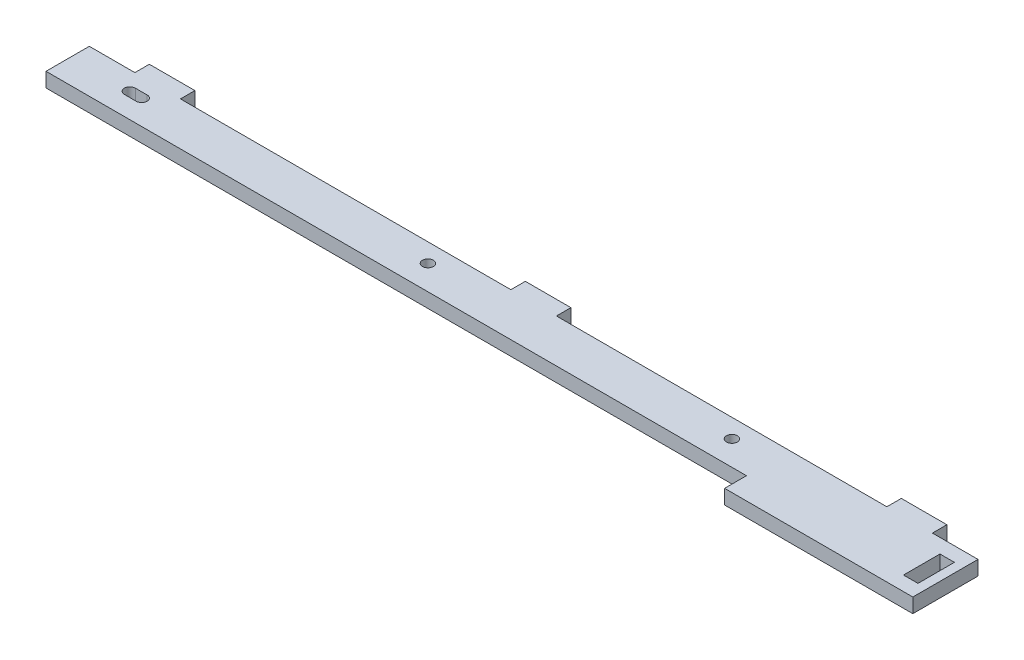
ISO-10303-21;
HEADER;
FILE_DESCRIPTION(('STEP AP214'),'2;1');
FILE_NAME('part.step','',(''),(''),'','','');
FILE_SCHEMA(('AUTOMOTIVE_DESIGN { 1 0 10303 214 1 1 1 1 }'));
ENDSEC;
DATA;
#1=APPLICATION_CONTEXT('core data for automotive mechanical design processes');
#2=APPLICATION_PROTOCOL_DEFINITION('international standard','automotive_design',2000,#1);
#3=PRODUCT_CONTEXT('',#1,'mechanical');
#4=PRODUCT('Part','Part','',(#3));
#5=PRODUCT_RELATED_PRODUCT_CATEGORY('part','',(#4));
#6=PRODUCT_DEFINITION_FORMATION('','',#4);
#7=PRODUCT_DEFINITION_CONTEXT('part definition',#1,'design');
#8=PRODUCT_DEFINITION('design','',#6,#7);
#9=PRODUCT_DEFINITION_SHAPE('','',#8);
#10=(LENGTH_UNIT() NAMED_UNIT(*) SI_UNIT(.MILLI.,.METRE.));
#11=(NAMED_UNIT(*) PLANE_ANGLE_UNIT() SI_UNIT($,.RADIAN.));
#12=(NAMED_UNIT(*) SI_UNIT($,.STERADIAN.) SOLID_ANGLE_UNIT());
#13=UNCERTAINTY_MEASURE_WITH_UNIT(LENGTH_MEASURE(1.E-05),#10,'distance_accuracy_value','');
#14=(GEOMETRIC_REPRESENTATION_CONTEXT(3) GLOBAL_UNCERTAINTY_ASSIGNED_CONTEXT((#13)) GLOBAL_UNIT_ASSIGNED_CONTEXT((#10,
#11,#12)) REPRESENTATION_CONTEXT('',''));
#15=CARTESIAN_POINT('',(0.,0.,0.));
#16=DIRECTION('',(0.,0.,1.));
#17=DIRECTION('',(1.,0.,0.));
#18=AXIS2_PLACEMENT_3D('',#15,#16,#17);
#19=CARTESIAN_POINT('',(0.,0.,0.));
#20=DIRECTION('',(0.,1.,0.));
#21=DIRECTION('',(0.,0.,1.));
#22=AXIS2_PLACEMENT_3D('',#19,#20,#21);
#23=PLANE('',#22);
#24=DIRECTION('',(1.,0.,0.));
#25=VECTOR('',#24,1.);
#26=CARTESIAN_POINT('',(92.3,0.,-1.60000000000001));
#27=LINE('',#26,#25);
#28=CARTESIAN_POINT('',(92.3,0.,-1.60000000000001));
#29=VERTEX_POINT('',#28);
#30=CARTESIAN_POINT('',(95.475,0.,-1.60000000000001));
#31=VERTEX_POINT('',#30);
#32=EDGE_CURVE('E329',#29,#31,#27,.T.);
#33=ORIENTED_EDGE('',*,*,#32,.F.);
#34=DIRECTION('',(0.,0.,-1.));
#35=VECTOR('',#34,1.);
#36=CARTESIAN_POINT('',(92.3,0.,-1.60000000000001));
#37=LINE('',#36,#35);
#38=CARTESIAN_POINT('',(92.3,0.,6.39999999999999));
#39=VERTEX_POINT('',#38);
#40=EDGE_CURVE('E315',#39,#29,#37,.T.);
#41=ORIENTED_EDGE('',*,*,#40,.F.);
#42=DIRECTION('',(-1.,0.,0.));
#43=VECTOR('',#42,1.);
#44=CARTESIAN_POINT('',(92.3,0.,6.39999999999999));
#45=LINE('',#44,#43);
#46=CARTESIAN_POINT('',(95.475,0.,6.39999999999999));
#47=VERTEX_POINT('',#46);
#48=EDGE_CURVE('E320',#47,#39,#45,.T.);
#49=ORIENTED_EDGE('',*,*,#48,.F.);
#50=DIRECTION('',(0.,0.,1.));
#51=VECTOR('',#50,1.);
#52=CARTESIAN_POINT('',(95.475,0.,-1.60000000000001));
#53=LINE('',#52,#51);
#54=EDGE_CURVE('E332',#31,#47,#53,.T.);
#55=ORIENTED_EDGE('',*,*,#54,.F.);
#56=EDGE_LOOP('',(#33,#41,#49,#55));
#57=FACE_BOUND('',#56,.T.);
#58=CARTESIAN_POINT('',(47.6,0.,-0.649999999999989));
#59=DIRECTION('',(0.,1.,0.));
#60=DIRECTION('',(0.,0.,1.));
#61=AXIS2_PLACEMENT_3D('',#58,#59,#60);
#62=CIRCLE('',#61,1.2);
#63=CARTESIAN_POINT('',(47.6,0.,0.550000000000011));
#64=VERTEX_POINT('',#63);
#65=EDGE_CURVE('E449',#64,#64,#62,.T.);
#66=ORIENTED_EDGE('',*,*,#65,.T.);
#67=EDGE_LOOP('',(#66));
#68=FACE_BOUND('',#67,.T.);
#69=CARTESIAN_POINT('',(-19.1,0.,-0.649999999999989));
#70=DIRECTION('',(0.,1.,0.));
#71=DIRECTION('',(0.,0.,1.));
#72=AXIS2_PLACEMENT_3D('',#69,#70,#71);
#73=CIRCLE('',#72,1.2);
#74=CARTESIAN_POINT('',(-19.1,0.,0.550000000000007));
#75=VERTEX_POINT('',#74);
#76=EDGE_CURVE('E455',#75,#75,#73,.T.);
#77=ORIENTED_EDGE('',*,*,#76,.T.);
#78=EDGE_LOOP('',(#77));
#79=FACE_BOUND('',#78,.T.);
#80=DIRECTION('',(0.,0.,1.));
#81=VECTOR('',#80,1.);
#82=CARTESIAN_POINT('',(-97.5,0.,4.75000000000001));
#83=LINE('',#82,#81);
#84=CARTESIAN_POINT('',(-97.5,0.,-4.74999999999999));
#85=VERTEX_POINT('',#84);
#86=CARTESIAN_POINT('',(-97.5,0.,4.75000000000001));
#87=VERTEX_POINT('',#86);
#88=EDGE_CURVE('E458',#85,#87,#83,.T.);
#89=ORIENTED_EDGE('',*,*,#88,.F.);
#90=DIRECTION('',(-1.,0.,0.));
#91=VECTOR('',#90,1.);
#92=CARTESIAN_POINT('',(97.5,0.,-4.75000000000001));
#93=LINE('',#92,#91);
#94=CARTESIAN_POINT('',(-87.5,0.,-4.74999999999999));
#95=VERTEX_POINT('',#94);
#96=EDGE_CURVE('E481',#95,#85,#93,.T.);
#97=ORIENTED_EDGE('',*,*,#96,.F.);
#98=DIRECTION('',(0.,0.,1.));
#99=VECTOR('',#98,1.);
#100=CARTESIAN_POINT('',(-87.5,0.,-7.92499999999999));
#101=LINE('',#100,#99);
#102=CARTESIAN_POINT('',(-87.5,0.,-7.92499999999999));
#103=VERTEX_POINT('',#102);
#104=EDGE_CURVE('E430',#103,#95,#101,.T.);
#105=ORIENTED_EDGE('',*,*,#104,.F.);
#106=DIRECTION('',(-1.,0.,0.));
#107=VECTOR('',#106,1.);
#108=CARTESIAN_POINT('',(-87.5,0.,-7.92499999999999));
#109=LINE('',#108,#107);
#110=CARTESIAN_POINT('',(-77.5,0.,-7.92499999999999));
#111=VERTEX_POINT('',#110);
#112=EDGE_CURVE('E428',#111,#103,#109,.T.);
#113=ORIENTED_EDGE('',*,*,#112,.F.);
#114=DIRECTION('',(0.,0.,1.));
#115=VECTOR('',#114,1.);
#116=CARTESIAN_POINT('',(-77.5,0.,-7.92499999999999));
#117=LINE('',#116,#115);
#118=CARTESIAN_POINT('',(-77.5,0.,-4.74999999999999));
#119=VERTEX_POINT('',#118);
#120=EDGE_CURVE('E437',#111,#119,#117,.T.);
#121=ORIENTED_EDGE('',*,*,#120,.T.);
#122=CARTESIAN_POINT('',(-5.,0.,-4.75));
#123=VERTEX_POINT('',#122);
#124=EDGE_CURVE('E484',#123,#119,#93,.T.);
#125=ORIENTED_EDGE('',*,*,#124,.F.);
#126=DIRECTION('',(0.,0.,1.));
#127=VECTOR('',#126,1.);
#128=CARTESIAN_POINT('',(-5.,0.,-7.925));
#129=LINE('',#128,#127);
#130=CARTESIAN_POINT('',(-5.,0.,-7.925));
#131=VERTEX_POINT('',#130);
#132=EDGE_CURVE('E376',#131,#123,#129,.T.);
#133=ORIENTED_EDGE('',*,*,#132,.F.);
#134=DIRECTION('',(-1.,0.,0.));
#135=VECTOR('',#134,1.);
#136=CARTESIAN_POINT('',(-5.,0.,-7.925));
#137=LINE('',#136,#135);
#138=CARTESIAN_POINT('',(5.,0.,-7.925));
#139=VERTEX_POINT('',#138);
#140=EDGE_CURVE('E374',#139,#131,#137,.T.);
#141=ORIENTED_EDGE('',*,*,#140,.F.);
#142=DIRECTION('',(0.,0.,1.));
#143=VECTOR('',#142,1.);
#144=CARTESIAN_POINT('',(5.,0.,-7.925));
#145=LINE('',#144,#143);
#146=CARTESIAN_POINT('',(5.,0.,-4.75));
#147=VERTEX_POINT('',#146);
#148=EDGE_CURVE('E383',#139,#147,#145,.T.);
#149=ORIENTED_EDGE('',*,*,#148,.T.);
#150=CARTESIAN_POINT('',(77.5,0.,-4.75000000000001));
#151=VERTEX_POINT('',#150);
#152=EDGE_CURVE('E483',#151,#147,#93,.T.);
#153=ORIENTED_EDGE('',*,*,#152,.F.);
#154=DIRECTION('',(0.,0.,1.));
#155=VECTOR('',#154,1.);
#156=CARTESIAN_POINT('',(77.5,0.,-7.92500000000001));
#157=LINE('',#156,#155);
#158=CARTESIAN_POINT('',(77.5,0.,-7.92500000000001));
#159=VERTEX_POINT('',#158);
#160=EDGE_CURVE('E413',#159,#151,#157,.T.);
#161=ORIENTED_EDGE('',*,*,#160,.F.);
#162=DIRECTION('',(-1.,0.,0.));
#163=VECTOR('',#162,1.);
#164=CARTESIAN_POINT('',(87.5,0.,-7.92500000000001));
#165=LINE('',#164,#163);
#166=CARTESIAN_POINT('',(87.5,0.,-7.92500000000001));
#167=VERTEX_POINT('',#166);
#168=EDGE_CURVE('E396',#167,#159,#165,.T.);
#169=ORIENTED_EDGE('',*,*,#168,.F.);
#170=DIRECTION('',(0.,0.,1.));
#171=VECTOR('',#170,1.);
#172=CARTESIAN_POINT('',(87.5,0.,-7.92500000000001));
#173=LINE('',#172,#171);
#174=CARTESIAN_POINT('',(87.5,0.,-4.75000000000001));
#175=VERTEX_POINT('',#174);
#176=EDGE_CURVE('E416',#167,#175,#173,.T.);
#177=ORIENTED_EDGE('',*,*,#176,.T.);
#178=CARTESIAN_POINT('',(97.5,0.,-4.75000000000001));
#179=VERTEX_POINT('',#178);
#180=EDGE_CURVE('E463',#179,#175,#93,.T.);
#181=ORIENTED_EDGE('',*,*,#180,.F.);
#182=DIRECTION('',(0.,0.,-1.));
#183=VECTOR('',#182,1.);
#184=CARTESIAN_POINT('',(97.5,0.,4.74999999999999));
#185=LINE('',#184,#183);
#186=CARTESIAN_POINT('',(97.5,0.,9.55));
#187=VERTEX_POINT('',#186);
#188=EDGE_CURVE('E479',#187,#179,#185,.T.);
#189=ORIENTED_EDGE('',*,*,#188,.F.);
#190=DIRECTION('',(1.,0.,0.));
#191=VECTOR('',#190,1.);
#192=CARTESIAN_POINT('',(56.2,0.,9.55));
#193=LINE('',#192,#191);
#194=CARTESIAN_POINT('',(56.2,0.,9.55));
#195=VERTEX_POINT('',#194);
#196=EDGE_CURVE('E349',#195,#187,#193,.T.);
#197=ORIENTED_EDGE('',*,*,#196,.F.);
#198=DIRECTION('',(0.,0.,-1.));
#199=VECTOR('',#198,1.);
#200=CARTESIAN_POINT('',(56.2,0.,9.55));
#201=LINE('',#200,#199);
#202=CARTESIAN_POINT('',(56.2,0.,4.75));
#203=VERTEX_POINT('',#202);
#204=EDGE_CURVE('E362',#195,#203,#201,.T.);
#205=ORIENTED_EDGE('',*,*,#204,.T.);
#206=DIRECTION('',(1.,0.,0.));
#207=VECTOR('',#206,1.);
#208=CARTESIAN_POINT('',(97.5,0.,4.74999999999999));
#209=LINE('',#208,#207);
#210=EDGE_CURVE('E477',#87,#203,#209,.T.);
#211=ORIENTED_EDGE('',*,*,#210,.F.);
#212=EDGE_LOOP('',(#89,#97,#105,#113,#121,#125,#133,#141,#149,#153,#161,#169,#177,#181,#189,
#197,#205,#211));
#213=FACE_BOUND('',#212,.T.);
#214=DIRECTION('',(1.,0.,0.));
#215=VECTOR('',#214,1.);
#216=CARTESIAN_POINT('',(-84.5,0.,-1.85000000000005));
#217=LINE('',#216,#215);
#218=CARTESIAN_POINT('',(-84.5,0.,-1.84999999999998));
#219=VERTEX_POINT('',#218);
#220=CARTESIAN_POINT('',(-81.9,0.,-1.85000000000005));
#221=VERTEX_POINT('',#220);
#222=EDGE_CURVE('E13',#219,#221,#217,.T.);
#223=ORIENTED_EDGE('',*,*,#222,.F.);
#224=CARTESIAN_POINT('',(-84.5,0.,-0.649999999999989));
#225=DIRECTION('',(0.,-1.,0.));
#226=DIRECTION('',(0.,0.,-1.));
#227=AXIS2_PLACEMENT_3D('',#224,#225,#226);
#228=CIRCLE('',#227,1.19999999999999);
#229=CARTESIAN_POINT('',(-84.5,0.,0.550000000000004));
#230=VERTEX_POINT('',#229);
#231=EDGE_CURVE('E301',#230,#219,#228,.T.);
#232=ORIENTED_EDGE('',*,*,#231,.F.);
#233=DIRECTION('',(1.,0.,0.));
#234=VECTOR('',#233,1.);
#235=CARTESIAN_POINT('',(-84.5,0.,0.550000000000004));
#236=LINE('',#235,#234);
#237=CARTESIAN_POINT('',(-81.9,0.,0.550000000000004));
#238=VERTEX_POINT('',#237);
#239=EDGE_CURVE('E123',#230,#238,#236,.T.);
#240=ORIENTED_EDGE('',*,*,#239,.T.);
#241=CARTESIAN_POINT('',(-81.9,0.,-0.649999999999989));
#242=DIRECTION('',(0.,-1.,0.));
#243=DIRECTION('',(0.,0.,-1.));
#244=AXIS2_PLACEMENT_3D('',#241,#242,#243);
#245=CIRCLE('',#244,1.19999999999999);
#246=EDGE_CURVE('E295',#221,#238,#245,.T.);
#247=ORIENTED_EDGE('',*,*,#246,.F.);
#248=EDGE_LOOP('',(#223,#232,#240,#247));
#249=FACE_BOUND('',#248,.T.);
#250=ADVANCED_FACE('F107',(#57,#68,#79,#213,#249),#23,.F.);
#251=CARTESIAN_POINT('',(97.5,3.175,4.74999999999999));
#252=DIRECTION('',(0.,0.,-1.));
#253=DIRECTION('',(-1.,0.,0.));
#254=AXIS2_PLACEMENT_3D('',#251,#252,#253);
#255=PLANE('',#254);
#256=DIRECTION('',(0.,-1.,0.));
#257=VECTOR('',#256,1.);
#258=CARTESIAN_POINT('',(56.2,3.175,4.75));
#259=LINE('',#258,#257);
#260=CARTESIAN_POINT('',(56.2,3.175,4.74999999999999));
#261=VERTEX_POINT('',#260);
#262=EDGE_CURVE('E339',#261,#203,#259,.T.);
#263=ORIENTED_EDGE('',*,*,#262,.F.);
#264=DIRECTION('',(1.,0.,0.));
#265=VECTOR('',#264,1.);
#266=CARTESIAN_POINT('',(97.5,3.175,4.74999999999999));
#267=LINE('',#266,#265);
#268=CARTESIAN_POINT('',(-97.5,3.175,4.75000000000001));
#269=VERTEX_POINT('',#268);
#270=EDGE_CURVE('E462',#269,#261,#267,.T.);
#271=ORIENTED_EDGE('',*,*,#270,.F.);
#272=DIRECTION('',(0.,-1.,0.));
#273=VECTOR('',#272,1.);
#274=CARTESIAN_POINT('',(-97.5,3.175,4.75000000000001));
#275=LINE('',#274,#273);
#276=EDGE_CURVE('E289',#269,#87,#275,.T.);
#277=ORIENTED_EDGE('',*,*,#276,.T.);
#278=ORIENTED_EDGE('',*,*,#210,.T.);
#279=EDGE_LOOP('',(#263,#271,#277,#278));
#280=FACE_BOUND('',#279,.T.);
#281=ADVANCED_FACE('F493',(#280),#255,.F.);
#282=CARTESIAN_POINT('',(97.5,3.175,-4.75000000000001));
#283=DIRECTION('',(0.,0.,1.));
#284=DIRECTION('',(1.,0.,0.));
#285=AXIS2_PLACEMENT_3D('',#282,#283,#284);
#286=PLANE('',#285);
#287=DIRECTION('',(0.,1.,0.));
#288=VECTOR('',#287,1.);
#289=CARTESIAN_POINT('',(-5.,0.,-4.75));
#290=LINE('',#289,#288);
#291=CARTESIAN_POINT('',(-5.,3.175,-4.75));
#292=VERTEX_POINT('',#291);
#293=EDGE_CURVE('E365',#123,#292,#290,.T.);
#294=ORIENTED_EDGE('',*,*,#293,.F.);
#295=ORIENTED_EDGE('',*,*,#124,.T.);
#296=DIRECTION('',(0.,-1.,0.));
#297=VECTOR('',#296,1.);
#298=CARTESIAN_POINT('',(-77.5,0.,-4.74999999999999));
#299=LINE('',#298,#297);
#300=CARTESIAN_POINT('',(-77.5,3.175,-4.74999999999999));
#301=VERTEX_POINT('',#300);
#302=EDGE_CURVE('E424',#301,#119,#299,.T.);
#303=ORIENTED_EDGE('',*,*,#302,.F.);
#304=DIRECTION('',(-1.,0.,0.));
#305=VECTOR('',#304,1.);
#306=CARTESIAN_POINT('',(97.5,3.175,-4.75000000000001));
#307=LINE('',#306,#305);
#308=EDGE_CURVE('E474',#292,#301,#307,.T.);
#309=ORIENTED_EDGE('',*,*,#308,.F.);
#310=EDGE_LOOP('',(#294,#295,#303,#309));
#311=FACE_BOUND('',#310,.T.);
#312=ADVANCED_FACE('F535',(#311),#286,.F.);
#313=DIRECTION('',(0.,-1.,0.));
#314=VECTOR('',#313,1.);
#315=CARTESIAN_POINT('',(5.,0.,-4.75));
#316=LINE('',#315,#314);
#317=CARTESIAN_POINT('',(5.,3.175,-4.75));
#318=VERTEX_POINT('',#317);
#319=EDGE_CURVE('E370',#318,#147,#316,.T.);
#320=ORIENTED_EDGE('',*,*,#319,.F.);
#321=CARTESIAN_POINT('',(77.5,3.175,-4.75000000000001));
#322=VERTEX_POINT('',#321);
#323=EDGE_CURVE('E473',#322,#318,#307,.T.);
#324=ORIENTED_EDGE('',*,*,#323,.F.);
#325=DIRECTION('',(0.,1.,0.));
#326=VECTOR('',#325,1.);
#327=CARTESIAN_POINT('',(77.5,0.,-4.75000000000001));
#328=LINE('',#327,#326);
#329=EDGE_CURVE('E397',#151,#322,#328,.T.);
#330=ORIENTED_EDGE('',*,*,#329,.F.);
#331=ORIENTED_EDGE('',*,*,#152,.T.);
#332=EDGE_LOOP('',(#320,#324,#330,#331));
#333=FACE_BOUND('',#332,.T.);
#334=ADVANCED_FACE('F514',(#333),#286,.F.);
#335=DIRECTION('',(0.,-1.,0.));
#336=VECTOR('',#335,1.);
#337=CARTESIAN_POINT('',(87.5,0.,-4.75000000000001));
#338=LINE('',#337,#336);
#339=CARTESIAN_POINT('',(87.5,3.175,-4.75000000000001));
#340=VERTEX_POINT('',#339);
#341=EDGE_CURVE('E392',#340,#175,#338,.T.);
#342=ORIENTED_EDGE('',*,*,#341,.F.);
#343=CARTESIAN_POINT('',(97.5,3.175,-4.75000000000001));
#344=VERTEX_POINT('',#343);
#345=EDGE_CURVE('E469',#344,#340,#307,.T.);
#346=ORIENTED_EDGE('',*,*,#345,.F.);
#347=DIRECTION('',(0.,-1.,0.));
#348=VECTOR('',#347,1.);
#349=CARTESIAN_POINT('',(97.5,3.175,-4.75000000000001));
#350=LINE('',#349,#348);
#351=EDGE_CURVE('E487',#344,#179,#350,.T.);
#352=ORIENTED_EDGE('',*,*,#351,.T.);
#353=ORIENTED_EDGE('',*,*,#180,.T.);
#354=EDGE_LOOP('',(#342,#346,#352,#353));
#355=FACE_BOUND('',#354,.T.);
#356=ADVANCED_FACE('F571',(#355),#286,.F.);
#357=DIRECTION('',(0.,1.,0.));
#358=VECTOR('',#357,1.);
#359=CARTESIAN_POINT('',(-87.5,0.,-4.74999999999999));
#360=LINE('',#359,#358);
#361=CARTESIAN_POINT('',(-87.5,3.175,-4.74999999999999));
#362=VERTEX_POINT('',#361);
#363=EDGE_CURVE('E419',#95,#362,#360,.T.);
#364=ORIENTED_EDGE('',*,*,#363,.F.);
#365=ORIENTED_EDGE('',*,*,#96,.T.);
#366=DIRECTION('',(0.,-1.,0.));
#367=VECTOR('',#366,1.);
#368=CARTESIAN_POINT('',(-97.5,3.175,-4.74999999999999));
#369=LINE('',#368,#367);
#370=CARTESIAN_POINT('',(-97.5,3.175,-4.74999999999999));
#371=VERTEX_POINT('',#370);
#372=EDGE_CURVE('E472',#371,#85,#369,.T.);
#373=ORIENTED_EDGE('',*,*,#372,.F.);
#374=EDGE_CURVE('E468',#362,#371,#307,.T.);
#375=ORIENTED_EDGE('',*,*,#374,.F.);
#376=EDGE_LOOP('',(#364,#365,#373,#375));
#377=FACE_BOUND('',#376,.T.);
#378=ADVANCED_FACE('F511',(#377),#286,.F.);
#379=CARTESIAN_POINT('',(-97.5,3.175,4.75000000000001));
#380=DIRECTION('',(1.,0.,0.));
#381=DIRECTION('',(0.,0.,-1.));
#382=AXIS2_PLACEMENT_3D('',#379,#380,#381);
#383=PLANE('',#382);
#384=ORIENTED_EDGE('',*,*,#88,.T.);
#385=ORIENTED_EDGE('',*,*,#276,.F.);
#386=DIRECTION('',(0.,0.,1.));
#387=VECTOR('',#386,1.);
#388=CARTESIAN_POINT('',(-97.5,3.175,4.75000000000001));
#389=LINE('',#388,#387);
#390=EDGE_CURVE('E459',#371,#269,#389,.T.);
#391=ORIENTED_EDGE('',*,*,#390,.F.);
#392=ORIENTED_EDGE('',*,*,#372,.T.);
#393=EDGE_LOOP('',(#384,#385,#391,#392));
#394=FACE_BOUND('',#393,.T.);
#395=ADVANCED_FACE('F109',(#394),#383,.F.);
#396=CARTESIAN_POINT('',(97.5,3.175,4.74999999999999));
#397=DIRECTION('',(-1.,0.,0.));
#398=DIRECTION('',(0.,0.,1.));
#399=AXIS2_PLACEMENT_3D('',#396,#397,#398);
#400=PLANE('',#399);
#401=ORIENTED_EDGE('',*,*,#188,.T.);
#402=ORIENTED_EDGE('',*,*,#351,.F.);
#403=DIRECTION('',(0.,0.,-1.));
#404=VECTOR('',#403,1.);
#405=CARTESIAN_POINT('',(97.5,3.175,4.74999999999999));
#406=LINE('',#405,#404);
#407=CARTESIAN_POINT('',(97.5,3.175,9.55));
#408=VERTEX_POINT('',#407);
#409=EDGE_CURVE('E466',#408,#344,#406,.T.);
#410=ORIENTED_EDGE('',*,*,#409,.F.);
#411=DIRECTION('',(0.,1.,0.));
#412=VECTOR('',#411,1.);
#413=CARTESIAN_POINT('',(97.5,3.175,9.55));
#414=LINE('',#413,#412);
#415=EDGE_CURVE('E352',#187,#408,#414,.T.);
#416=ORIENTED_EDGE('',*,*,#415,.F.);
#417=EDGE_LOOP('',(#401,#402,#410,#416));
#418=FACE_BOUND('',#417,.T.);
#419=ADVANCED_FACE('F572',(#418),#400,.F.);
#420=CARTESIAN_POINT('',(0.,3.175,0.));
#421=DIRECTION('',(0.,1.,0.));
#422=DIRECTION('',(0.,0.,1.));
#423=AXIS2_PLACEMENT_3D('',#420,#421,#422);
#424=PLANE('',#423);
#425=CARTESIAN_POINT('',(-81.9,3.175,-0.649999999999989));
#426=DIRECTION('',(0.,-1.,0.));
#427=DIRECTION('',(0.,0.,-1.));
#428=AXIS2_PLACEMENT_3D('',#425,#426,#427);
#429=CIRCLE('',#428,1.19999999999999);
#430=CARTESIAN_POINT('',(-81.9,3.175,-1.84999999999998));
#431=VERTEX_POINT('',#430);
#432=CARTESIAN_POINT('',(-81.9,3.175,0.550000000000004));
#433=VERTEX_POINT('',#432);
#434=EDGE_CURVE('E287',#431,#433,#429,.T.);
#435=ORIENTED_EDGE('',*,*,#434,.T.);
#436=DIRECTION('',(1.,0.,0.));
#437=VECTOR('',#436,1.);
#438=CARTESIAN_POINT('',(0.,3.175,0.550000000000004));
#439=LINE('',#438,#437);
#440=CARTESIAN_POINT('',(-84.5,3.175,0.550000000000004));
#441=VERTEX_POINT('',#440);
#442=EDGE_CURVE('E281',#441,#433,#439,.T.);
#443=ORIENTED_EDGE('',*,*,#442,.F.);
#444=CARTESIAN_POINT('',(-84.5,3.175,-0.649999999999989));
#445=DIRECTION('',(0.,-1.,0.));
#446=DIRECTION('',(0.,0.,-1.));
#447=AXIS2_PLACEMENT_3D('',#444,#445,#446);
#448=CIRCLE('',#447,1.19999999999999);
#449=CARTESIAN_POINT('',(-84.5,3.175,-1.84999999999998));
#450=VERTEX_POINT('',#449);
#451=EDGE_CURVE('E286',#441,#450,#448,.T.);
#452=ORIENTED_EDGE('',*,*,#451,.T.);
#453=DIRECTION('',(-1.,0.,0.));
#454=VECTOR('',#453,1.);
#455=CARTESIAN_POINT('',(0.,3.175,-1.84999999999998));
#456=LINE('',#455,#454);
#457=EDGE_CURVE('E111',#431,#450,#456,.T.);
#458=ORIENTED_EDGE('',*,*,#457,.F.);
#459=EDGE_LOOP('',(#435,#443,#452,#458));
#460=FACE_BOUND('',#459,.T.);
#461=DIRECTION('',(0.,0.,-1.));
#462=VECTOR('',#461,1.);
#463=CARTESIAN_POINT('',(92.3,3.175,-1.60000000000001));
#464=LINE('',#463,#462);
#465=CARTESIAN_POINT('',(92.3,3.175,6.39999999999999));
#466=VERTEX_POINT('',#465);
#467=CARTESIAN_POINT('',(92.3,3.175,-1.60000000000001));
#468=VERTEX_POINT('',#467);
#469=EDGE_CURVE('E316',#466,#468,#464,.T.);
#470=ORIENTED_EDGE('',*,*,#469,.T.);
#471=DIRECTION('',(1.,0.,0.));
#472=VECTOR('',#471,1.);
#473=CARTESIAN_POINT('',(92.3,3.175,-1.60000000000001));
#474=LINE('',#473,#472);
#475=CARTESIAN_POINT('',(95.475,3.175,-1.60000000000001));
#476=VERTEX_POINT('',#475);
#477=EDGE_CURVE('E319',#468,#476,#474,.T.);
#478=ORIENTED_EDGE('',*,*,#477,.T.);
#479=DIRECTION('',(0.,0.,1.));
#480=VECTOR('',#479,1.);
#481=CARTESIAN_POINT('',(95.475,3.175,-1.60000000000001));
#482=LINE('',#481,#480);
#483=CARTESIAN_POINT('',(95.475,3.175,6.39999999999999));
#484=VERTEX_POINT('',#483);
#485=EDGE_CURVE('E131',#476,#484,#482,.T.);
#486=ORIENTED_EDGE('',*,*,#485,.T.);
#487=DIRECTION('',(-1.,0.,0.));
#488=VECTOR('',#487,1.);
#489=CARTESIAN_POINT('',(92.3,3.175,6.39999999999999));
#490=LINE('',#489,#488);
#491=EDGE_CURVE('E324',#484,#466,#490,.T.);
#492=ORIENTED_EDGE('',*,*,#491,.T.);
#493=EDGE_LOOP('',(#470,#478,#486,#492));
#494=FACE_BOUND('',#493,.T.);
#495=CARTESIAN_POINT('',(47.6,3.175,-0.649999999999989));
#496=DIRECTION('',(0.,1.,0.));
#497=DIRECTION('',(0.,0.,1.));
#498=AXIS2_PLACEMENT_3D('',#495,#496,#497);
#499=CIRCLE('',#498,1.2);
#500=CARTESIAN_POINT('',(47.6,3.175,0.550000000000011));
#501=VERTEX_POINT('',#500);
#502=EDGE_CURVE('E446',#501,#501,#499,.T.);
#503=ORIENTED_EDGE('',*,*,#502,.F.);
#504=EDGE_LOOP('',(#503));
#505=FACE_BOUND('',#504,.T.);
#506=CARTESIAN_POINT('',(-19.1,3.175,-0.649999999999989));
#507=DIRECTION('',(0.,1.,0.));
#508=DIRECTION('',(0.,0.,1.));
#509=AXIS2_PLACEMENT_3D('',#506,#507,#508);
#510=CIRCLE('',#509,1.2);
#511=CARTESIAN_POINT('',(-19.1,3.175,0.550000000000011));
#512=VERTEX_POINT('',#511);
#513=EDGE_CURVE('E452',#512,#512,#510,.T.);
#514=ORIENTED_EDGE('',*,*,#513,.F.);
#515=EDGE_LOOP('',(#514));
#516=FACE_BOUND('',#515,.T.);
#517=ORIENTED_EDGE('',*,*,#390,.T.);
#518=ORIENTED_EDGE('',*,*,#270,.T.);
#519=DIRECTION('',(0.,0.,-1.));
#520=VECTOR('',#519,1.);
#521=CARTESIAN_POINT('',(56.2,3.175,9.55));
#522=LINE('',#521,#520);
#523=CARTESIAN_POINT('',(56.2,3.175,9.55));
#524=VERTEX_POINT('',#523);
#525=EDGE_CURVE('E357',#524,#261,#522,.T.);
#526=ORIENTED_EDGE('',*,*,#525,.F.);
#527=DIRECTION('',(-1.,0.,0.));
#528=VECTOR('',#527,1.);
#529=CARTESIAN_POINT('',(56.2,3.175,9.55));
#530=LINE('',#529,#528);
#531=EDGE_CURVE('E355',#408,#524,#530,.T.);
#532=ORIENTED_EDGE('',*,*,#531,.F.);
#533=ORIENTED_EDGE('',*,*,#409,.T.);
#534=ORIENTED_EDGE('',*,*,#345,.T.);
#535=DIRECTION('',(0.,0.,1.));
#536=VECTOR('',#535,1.);
#537=CARTESIAN_POINT('',(87.5,3.175,-7.92500000000001));
#538=LINE('',#537,#536);
#539=CARTESIAN_POINT('',(87.5,3.175,-7.92500000000001));
#540=VERTEX_POINT('',#539);
#541=EDGE_CURVE('E403',#540,#340,#538,.T.);
#542=ORIENTED_EDGE('',*,*,#541,.F.);
#543=DIRECTION('',(1.,0.,0.));
#544=VECTOR('',#543,1.);
#545=CARTESIAN_POINT('',(87.5,3.175,-7.92500000000001));
#546=LINE('',#545,#544);
#547=CARTESIAN_POINT('',(77.5,3.175,-7.92500000000001));
#548=VERTEX_POINT('',#547);
#549=EDGE_CURVE('E401',#548,#540,#546,.T.);
#550=ORIENTED_EDGE('',*,*,#549,.F.);
#551=DIRECTION('',(0.,0.,1.));
#552=VECTOR('',#551,1.);
#553=CARTESIAN_POINT('',(77.5,3.175,-7.92500000000001));
#554=LINE('',#553,#552);
#555=EDGE_CURVE('E410',#548,#322,#554,.T.);
#556=ORIENTED_EDGE('',*,*,#555,.T.);
#557=ORIENTED_EDGE('',*,*,#323,.T.);
#558=DIRECTION('',(0.,0.,1.));
#559=VECTOR('',#558,1.);
#560=CARTESIAN_POINT('',(5.,3.175,-7.925));
#561=LINE('',#560,#559);
#562=CARTESIAN_POINT('',(5.,3.175,-7.925));
#563=VERTEX_POINT('',#562);
#564=EDGE_CURVE('E386',#563,#318,#561,.T.);
#565=ORIENTED_EDGE('',*,*,#564,.F.);
#566=DIRECTION('',(1.,0.,0.));
#567=VECTOR('',#566,1.);
#568=CARTESIAN_POINT('',(-5.00000000000001,3.175,-7.925));
#569=LINE('',#568,#567);
#570=CARTESIAN_POINT('',(-5.00000000000001,3.175,-7.925));
#571=VERTEX_POINT('',#570);
#572=EDGE_CURVE('E369',#571,#563,#569,.T.);
#573=ORIENTED_EDGE('',*,*,#572,.F.);
#574=DIRECTION('',(0.,0.,1.));
#575=VECTOR('',#574,1.);
#576=CARTESIAN_POINT('',(-5.00000000000001,3.175,-7.925));
#577=LINE('',#576,#575);
#578=EDGE_CURVE('E389',#571,#292,#577,.T.);
#579=ORIENTED_EDGE('',*,*,#578,.T.);
#580=ORIENTED_EDGE('',*,*,#308,.T.);
#581=DIRECTION('',(0.,0.,1.));
#582=VECTOR('',#581,1.);
#583=CARTESIAN_POINT('',(-77.5,3.175,-7.92499999999999));
#584=LINE('',#583,#582);
#585=CARTESIAN_POINT('',(-77.5,3.175,-7.92499999999999));
#586=VERTEX_POINT('',#585);
#587=EDGE_CURVE('E440',#586,#301,#584,.T.);
#588=ORIENTED_EDGE('',*,*,#587,.F.);
#589=DIRECTION('',(1.,0.,0.));
#590=VECTOR('',#589,1.);
#591=CARTESIAN_POINT('',(-87.5,3.175,-7.92499999999999));
#592=LINE('',#591,#590);
#593=CARTESIAN_POINT('',(-87.5,3.175,-7.92499999999999));
#594=VERTEX_POINT('',#593);
#595=EDGE_CURVE('E423',#594,#586,#592,.T.);
#596=ORIENTED_EDGE('',*,*,#595,.F.);
#597=DIRECTION('',(0.,0.,1.));
#598=VECTOR('',#597,1.);
#599=CARTESIAN_POINT('',(-87.5,3.175,-7.92499999999999));
#600=LINE('',#599,#598);
#601=EDGE_CURVE('E443',#594,#362,#600,.T.);
#602=ORIENTED_EDGE('',*,*,#601,.T.);
#603=ORIENTED_EDGE('',*,*,#374,.T.);
#604=EDGE_LOOP('',(#517,#518,#526,#532,#533,#534,#542,#550,#556,#557,#565,#573,#579,#580,#588,
#596,#602,#603));
#605=FACE_BOUND('',#604,.T.);
#606=ADVANCED_FACE('F282',(#460,#494,#505,#516,#605),#424,.T.);
#607=CARTESIAN_POINT('',(-19.1,3.175,-0.649999999999989));
#608=DIRECTION('',(0.,1.,0.));
#609=DIRECTION('',(0.,0.,1.));
#610=AXIS2_PLACEMENT_3D('',#607,#608,#609);
#611=CYLINDRICAL_SURFACE('',#610,1.2);
#612=ORIENTED_EDGE('',*,*,#76,.F.);
#613=EDGE_LOOP('',(#612));
#614=FACE_BOUND('',#613,.T.);
#615=ORIENTED_EDGE('',*,*,#513,.T.);
#616=EDGE_LOOP('',(#615));
#617=FACE_BOUND('',#616,.T.);
#618=ADVANCED_FACE('F579',(#614,#617),#611,.F.);
#619=CARTESIAN_POINT('',(47.6,3.175,-0.649999999999989));
#620=DIRECTION('',(0.,1.,0.));
#621=DIRECTION('',(0.,0.,1.));
#622=AXIS2_PLACEMENT_3D('',#619,#620,#621);
#623=CYLINDRICAL_SURFACE('',#622,1.2);
#624=ORIENTED_EDGE('',*,*,#65,.F.);
#625=EDGE_LOOP('',(#624));
#626=FACE_BOUND('',#625,.T.);
#627=ORIENTED_EDGE('',*,*,#502,.T.);
#628=EDGE_LOOP('',(#627));
#629=FACE_BOUND('',#628,.T.);
#630=ADVANCED_FACE('F713',(#626,#629),#623,.F.);
#631=CARTESIAN_POINT('',(-87.5,0.,-7.92499999999999));
#632=DIRECTION('',(1.,0.,0.));
#633=DIRECTION('',(0.,1.,0.));
#634=AXIS2_PLACEMENT_3D('',#631,#632,#633);
#635=PLANE('',#634);
#636=ORIENTED_EDGE('',*,*,#363,.T.);
#637=ORIENTED_EDGE('',*,*,#601,.F.);
#638=DIRECTION('',(0.,1.,0.));
#639=VECTOR('',#638,1.);
#640=CARTESIAN_POINT('',(-87.5,0.,-7.92499999999999));
#641=LINE('',#640,#639);
#642=EDGE_CURVE('E420',#103,#594,#641,.T.);
#643=ORIENTED_EDGE('',*,*,#642,.F.);
#644=ORIENTED_EDGE('',*,*,#104,.T.);
#645=EDGE_LOOP('',(#636,#637,#643,#644));
#646=FACE_BOUND('',#645,.T.);
#647=ADVANCED_FACE('F544',(#646),#635,.F.);
#648=CARTESIAN_POINT('',(-77.5,0.,-7.92499999999999));
#649=DIRECTION('',(-1.,0.,0.));
#650=DIRECTION('',(0.,0.,1.));
#651=AXIS2_PLACEMENT_3D('',#648,#649,#650);
#652=PLANE('',#651);
#653=ORIENTED_EDGE('',*,*,#302,.T.);
#654=ORIENTED_EDGE('',*,*,#120,.F.);
#655=DIRECTION('',(0.,-1.,0.));
#656=VECTOR('',#655,1.);
#657=CARTESIAN_POINT('',(-77.5,0.,-7.92499999999999));
#658=LINE('',#657,#656);
#659=EDGE_CURVE('E426',#586,#111,#658,.T.);
#660=ORIENTED_EDGE('',*,*,#659,.F.);
#661=ORIENTED_EDGE('',*,*,#587,.T.);
#662=EDGE_LOOP('',(#653,#654,#660,#661));
#663=FACE_BOUND('',#662,.T.);
#664=ADVANCED_FACE('F538',(#663),#652,.F.);
#665=CARTESIAN_POINT('',(0.,0.,-7.925));
#666=DIRECTION('',(0.,0.,-1.));
#667=DIRECTION('',(-1.,0.,0.));
#668=AXIS2_PLACEMENT_3D('',#665,#666,#667);
#669=PLANE('',#668);
#670=ORIENTED_EDGE('',*,*,#642,.T.);
#671=ORIENTED_EDGE('',*,*,#595,.T.);
#672=ORIENTED_EDGE('',*,*,#659,.T.);
#673=ORIENTED_EDGE('',*,*,#112,.T.);
#674=EDGE_LOOP('',(#670,#671,#672,#673));
#675=FACE_BOUND('',#674,.T.);
#676=ADVANCED_FACE('F541',(#675),#669,.T.);
#677=CARTESIAN_POINT('',(87.5,0.,-7.92500000000001));
#678=DIRECTION('',(-1.,0.,0.));
#679=DIRECTION('',(0.,-1.,0.));
#680=AXIS2_PLACEMENT_3D('',#677,#678,#679);
#681=PLANE('',#680);
#682=ORIENTED_EDGE('',*,*,#341,.T.);
#683=ORIENTED_EDGE('',*,*,#176,.F.);
#684=DIRECTION('',(0.,-1.,0.));
#685=VECTOR('',#684,1.);
#686=CARTESIAN_POINT('',(87.5,0.,-7.92500000000001));
#687=LINE('',#686,#685);
#688=EDGE_CURVE('E393',#540,#167,#687,.T.);
#689=ORIENTED_EDGE('',*,*,#688,.F.);
#690=ORIENTED_EDGE('',*,*,#541,.T.);
#691=EDGE_LOOP('',(#682,#683,#689,#690));
#692=FACE_BOUND('',#691,.T.);
#693=ADVANCED_FACE('F588',(#692),#681,.F.);
#694=CARTESIAN_POINT('',(77.5,0.,-7.92500000000001));
#695=DIRECTION('',(1.,0.,0.));
#696=DIRECTION('',(0.,0.,-1.));
#697=AXIS2_PLACEMENT_3D('',#694,#695,#696);
#698=PLANE('',#697);
#699=ORIENTED_EDGE('',*,*,#329,.T.);
#700=ORIENTED_EDGE('',*,*,#555,.F.);
#701=DIRECTION('',(0.,1.,0.));
#702=VECTOR('',#701,1.);
#703=CARTESIAN_POINT('',(77.5,0.,-7.92500000000001));
#704=LINE('',#703,#702);
#705=EDGE_CURVE('E399',#159,#548,#704,.T.);
#706=ORIENTED_EDGE('',*,*,#705,.F.);
#707=ORIENTED_EDGE('',*,*,#160,.T.);
#708=EDGE_LOOP('',(#699,#700,#706,#707));
#709=FACE_BOUND('',#708,.T.);
#710=ADVANCED_FACE('F555',(#709),#698,.F.);
#711=CARTESIAN_POINT('',(0.,0.,-7.925));
#712=DIRECTION('',(0.,0.,1.));
#713=DIRECTION('',(1.,0.,0.));
#714=AXIS2_PLACEMENT_3D('',#711,#712,#713);
#715=PLANE('',#714);
#716=ORIENTED_EDGE('',*,*,#688,.T.);
#717=ORIENTED_EDGE('',*,*,#168,.T.);
#718=ORIENTED_EDGE('',*,*,#705,.T.);
#719=ORIENTED_EDGE('',*,*,#549,.T.);
#720=EDGE_LOOP('',(#716,#717,#718,#719));
#721=FACE_BOUND('',#720,.T.);
#722=ADVANCED_FACE('F548',(#721),#715,.F.);
#723=CARTESIAN_POINT('',(-5.,0.,-7.925));
#724=DIRECTION('',(1.,0.,0.));
#725=DIRECTION('',(0.,1.,0.));
#726=AXIS2_PLACEMENT_3D('',#723,#724,#725);
#727=PLANE('',#726);
#728=ORIENTED_EDGE('',*,*,#293,.T.);
#729=ORIENTED_EDGE('',*,*,#578,.F.);
#730=DIRECTION('',(0.,1.,0.));
#731=VECTOR('',#730,1.);
#732=CARTESIAN_POINT('',(-5.,0.,-7.925));
#733=LINE('',#732,#731);
#734=EDGE_CURVE('E366',#131,#571,#733,.T.);
#735=ORIENTED_EDGE('',*,*,#734,.F.);
#736=ORIENTED_EDGE('',*,*,#132,.T.);
#737=EDGE_LOOP('',(#728,#729,#735,#736));
#738=FACE_BOUND('',#737,.T.);
#739=ADVANCED_FACE('F546',(#738),#727,.F.);
#740=CARTESIAN_POINT('',(5.,0.,-7.925));
#741=DIRECTION('',(-1.,0.,0.));
#742=DIRECTION('',(0.,-1.,0.));
#743=AXIS2_PLACEMENT_3D('',#740,#741,#742);
#744=PLANE('',#743);
#745=ORIENTED_EDGE('',*,*,#319,.T.);
#746=ORIENTED_EDGE('',*,*,#148,.F.);
#747=DIRECTION('',(0.,-1.,0.));
#748=VECTOR('',#747,1.);
#749=CARTESIAN_POINT('',(5.,0.,-7.925));
#750=LINE('',#749,#748);
#751=EDGE_CURVE('E372',#563,#139,#750,.T.);
#752=ORIENTED_EDGE('',*,*,#751,.F.);
#753=ORIENTED_EDGE('',*,*,#564,.T.);
#754=EDGE_LOOP('',(#745,#746,#752,#753));
#755=FACE_BOUND('',#754,.T.);
#756=ADVANCED_FACE('F519',(#755),#744,.F.);
#757=CARTESIAN_POINT('',(0.,0.,-7.925));
#758=DIRECTION('',(0.,0.,-1.));
#759=DIRECTION('',(-1.,0.,0.));
#760=AXIS2_PLACEMENT_3D('',#757,#758,#759);
#761=PLANE('',#760);
#762=ORIENTED_EDGE('',*,*,#734,.T.);
#763=ORIENTED_EDGE('',*,*,#572,.T.);
#764=ORIENTED_EDGE('',*,*,#751,.T.);
#765=ORIENTED_EDGE('',*,*,#140,.T.);
#766=EDGE_LOOP('',(#762,#763,#764,#765));
#767=FACE_BOUND('',#766,.T.);
#768=ADVANCED_FACE('F526',(#767),#761,.T.);
#769=CARTESIAN_POINT('',(56.2,3.175,9.55));
#770=DIRECTION('',(1.,0.,0.));
#771=DIRECTION('',(0.,1.,0.));
#772=AXIS2_PLACEMENT_3D('',#769,#770,#771);
#773=PLANE('',#772);
#774=ORIENTED_EDGE('',*,*,#262,.T.);
#775=ORIENTED_EDGE('',*,*,#204,.F.);
#776=DIRECTION('',(0.,-1.,0.));
#777=VECTOR('',#776,1.);
#778=CARTESIAN_POINT('',(56.2,3.175,9.55));
#779=LINE('',#778,#777);
#780=EDGE_CURVE('E346',#524,#195,#779,.T.);
#781=ORIENTED_EDGE('',*,*,#780,.F.);
#782=ORIENTED_EDGE('',*,*,#525,.T.);
#783=EDGE_LOOP('',(#774,#775,#781,#782));
#784=FACE_BOUND('',#783,.T.);
#785=ADVANCED_FACE('F505',(#784),#773,.F.);
#786=CARTESIAN_POINT('',(0.,0.,9.55));
#787=DIRECTION('',(0.,0.,1.));
#788=DIRECTION('',(1.,0.,0.));
#789=AXIS2_PLACEMENT_3D('',#786,#787,#788);
#790=PLANE('',#789);
#791=ORIENTED_EDGE('',*,*,#780,.T.);
#792=ORIENTED_EDGE('',*,*,#196,.T.);
#793=ORIENTED_EDGE('',*,*,#415,.T.);
#794=ORIENTED_EDGE('',*,*,#531,.T.);
#795=EDGE_LOOP('',(#791,#792,#793,#794));
#796=FACE_BOUND('',#795,.T.);
#797=ADVANCED_FACE('F591',(#796),#790,.T.);
#798=CARTESIAN_POINT('',(92.3,3.175,-1.60000000000001));
#799=DIRECTION('',(-1.,0.,0.));
#800=DIRECTION('',(0.,0.,1.));
#801=AXIS2_PLACEMENT_3D('',#798,#799,#800);
#802=PLANE('',#801);
#803=ORIENTED_EDGE('',*,*,#40,.T.);
#804=DIRECTION('',(0.,-1.,0.));
#805=VECTOR('',#804,1.);
#806=CARTESIAN_POINT('',(92.3,3.175,-1.60000000000001));
#807=LINE('',#806,#805);
#808=EDGE_CURVE('E327',#468,#29,#807,.T.);
#809=ORIENTED_EDGE('',*,*,#808,.F.);
#810=ORIENTED_EDGE('',*,*,#469,.F.);
#811=DIRECTION('',(0.,-1.,0.));
#812=VECTOR('',#811,1.);
#813=CARTESIAN_POINT('',(92.3,3.175,6.39999999999999));
#814=LINE('',#813,#812);
#815=EDGE_CURVE('E337',#466,#39,#814,.T.);
#816=ORIENTED_EDGE('',*,*,#815,.T.);
#817=EDGE_LOOP('',(#803,#809,#810,#816));
#818=FACE_BOUND('',#817,.T.);
#819=ADVANCED_FACE('F593',(#818),#802,.F.);
#820=CARTESIAN_POINT('',(92.3,3.175,6.39999999999999));
#821=DIRECTION('',(0.,0.,1.));
#822=DIRECTION('',(1.,0.,0.));
#823=AXIS2_PLACEMENT_3D('',#820,#821,#822);
#824=PLANE('',#823);
#825=ORIENTED_EDGE('',*,*,#48,.T.);
#826=ORIENTED_EDGE('',*,*,#815,.F.);
#827=ORIENTED_EDGE('',*,*,#491,.F.);
#828=DIRECTION('',(0.,-1.,0.));
#829=VECTOR('',#828,1.);
#830=CARTESIAN_POINT('',(95.475,3.175,6.39999999999999));
#831=LINE('',#830,#829);
#832=EDGE_CURVE('E340',#484,#47,#831,.T.);
#833=ORIENTED_EDGE('',*,*,#832,.T.);
#834=EDGE_LOOP('',(#825,#826,#827,#833));
#835=FACE_BOUND('',#834,.T.);
#836=ADVANCED_FACE('F599',(#835),#824,.F.);
#837=CARTESIAN_POINT('',(95.475,3.175,-1.60000000000001));
#838=DIRECTION('',(1.,0.,0.));
#839=DIRECTION('',(0.,0.,-1.));
#840=AXIS2_PLACEMENT_3D('',#837,#838,#839);
#841=PLANE('',#840);
#842=ORIENTED_EDGE('',*,*,#54,.T.);
#843=ORIENTED_EDGE('',*,*,#832,.F.);
#844=ORIENTED_EDGE('',*,*,#485,.F.);
#845=DIRECTION('',(0.,-1.,0.));
#846=VECTOR('',#845,1.);
#847=CARTESIAN_POINT('',(95.475,3.175,-1.60000000000001));
#848=LINE('',#847,#846);
#849=EDGE_CURVE('E342',#476,#31,#848,.T.);
#850=ORIENTED_EDGE('',*,*,#849,.T.);
#851=EDGE_LOOP('',(#842,#843,#844,#850));
#852=FACE_BOUND('',#851,.T.);
#853=ADVANCED_FACE('F637',(#852),#841,.F.);
#854=CARTESIAN_POINT('',(92.3,3.175,-1.60000000000001));
#855=DIRECTION('',(0.,0.,-1.));
#856=DIRECTION('',(-1.,0.,0.));
#857=AXIS2_PLACEMENT_3D('',#854,#855,#856);
#858=PLANE('',#857);
#859=ORIENTED_EDGE('',*,*,#32,.T.);
#860=ORIENTED_EDGE('',*,*,#849,.F.);
#861=ORIENTED_EDGE('',*,*,#477,.F.);
#862=ORIENTED_EDGE('',*,*,#808,.T.);
#863=EDGE_LOOP('',(#859,#860,#861,#862));
#864=FACE_BOUND('',#863,.T.);
#865=ADVANCED_FACE('F647',(#864),#858,.F.);
#866=CARTESIAN_POINT('',(-84.5,0.,-1.84999999999998));
#867=DIRECTION('',(0.,0.,-1.));
#868=DIRECTION('',(-1.,0.,0.));
#869=AXIS2_PLACEMENT_3D('',#866,#867,#868);
#870=PLANE('',#869);
#871=ORIENTED_EDGE('',*,*,#457,.T.);
#872=DIRECTION('',(0.,-1.,0.));
#873=VECTOR('',#872,1.);
#874=CARTESIAN_POINT('',(-84.5,0.,-1.84999999999998));
#875=LINE('',#874,#873);
#876=EDGE_CURVE('E296',#450,#219,#875,.T.);
#877=ORIENTED_EDGE('',*,*,#876,.T.);
#878=ORIENTED_EDGE('',*,*,#222,.T.);
#879=DIRECTION('',(0.,-1.,0.));
#880=VECTOR('',#879,1.);
#881=CARTESIAN_POINT('',(-81.9,0.,-1.84999999999998));
#882=LINE('',#881,#880);
#883=EDGE_CURVE('E312',#221,#431,#882,.F.);
#884=ORIENTED_EDGE('',*,*,#883,.T.);
#885=EDGE_LOOP('',(#871,#877,#878,#884));
#886=FACE_BOUND('',#885,.T.);
#887=ADVANCED_FACE('F655',(#886),#870,.F.);
#888=CARTESIAN_POINT('',(-84.5,0.,0.550000000000004));
#889=DIRECTION('',(0.,0.,1.));
#890=DIRECTION('',(1.,0.,0.));
#891=AXIS2_PLACEMENT_3D('',#888,#889,#890);
#892=PLANE('',#891);
#893=ORIENTED_EDGE('',*,*,#442,.T.);
#894=DIRECTION('',(0.,-1.,0.));
#895=VECTOR('',#894,1.);
#896=CARTESIAN_POINT('',(-81.9,0.,0.550000000000004));
#897=LINE('',#896,#895);
#898=EDGE_CURVE('E310',#433,#238,#897,.T.);
#899=ORIENTED_EDGE('',*,*,#898,.T.);
#900=ORIENTED_EDGE('',*,*,#239,.F.);
#901=DIRECTION('',(0.,-1.,0.));
#902=VECTOR('',#901,1.);
#903=CARTESIAN_POINT('',(-84.5,0.,0.550000000000004));
#904=LINE('',#903,#902);
#905=EDGE_CURVE('E290',#230,#441,#904,.F.);
#906=ORIENTED_EDGE('',*,*,#905,.T.);
#907=EDGE_LOOP('',(#893,#899,#900,#906));
#908=FACE_BOUND('',#907,.T.);
#909=ADVANCED_FACE('F291',(#908),#892,.F.);
#910=CARTESIAN_POINT('',(-81.9,0.,-0.649999999999989));
#911=DIRECTION('',(0.,-1.,0.));
#912=DIRECTION('',(0.,0.,-1.));
#913=AXIS2_PLACEMENT_3D('',#910,#911,#912);
#914=CYLINDRICAL_SURFACE('',#913,1.19999999999999);
#915=ORIENTED_EDGE('',*,*,#434,.F.);
#916=ORIENTED_EDGE('',*,*,#883,.F.);
#917=ORIENTED_EDGE('',*,*,#246,.T.);
#918=ORIENTED_EDGE('',*,*,#898,.F.);
#919=EDGE_LOOP('',(#915,#916,#917,#918));
#920=FACE_BOUND('',#919,.T.);
#921=ADVANCED_FACE('F687',(#920),#914,.F.);
#922=CARTESIAN_POINT('',(-84.5,0.,-0.649999999999989));
#923=DIRECTION('',(0.,-1.,0.));
#924=DIRECTION('',(0.,0.,-1.));
#925=AXIS2_PLACEMENT_3D('',#922,#923,#924);
#926=CYLINDRICAL_SURFACE('',#925,1.19999999999999);
#927=ORIENTED_EDGE('',*,*,#231,.T.);
#928=ORIENTED_EDGE('',*,*,#876,.F.);
#929=ORIENTED_EDGE('',*,*,#451,.F.);
#930=ORIENTED_EDGE('',*,*,#905,.F.);
#931=EDGE_LOOP('',(#927,#928,#929,#930));
#932=FACE_BOUND('',#931,.T.);
#933=ADVANCED_FACE('F299',(#932),#926,.F.);
#934=CLOSED_SHELL('',(#250,#281,#312,#334,#356,#378,#395,#419,#606,#618,#630,#647,#664,#676,
#693,#710,#722,#739,#756,#768,#785,#797,#819,#836,#853,#865,#887,#909,#921,#933));
#935=MANIFOLD_SOLID_BREP('B2',#934);
#936=ADVANCED_BREP_SHAPE_REPRESENTATION('',(#18,#935),#14);
#937=SHAPE_DEFINITION_REPRESENTATION(#9,#936);
ENDSEC;
END-ISO-10303-21;
